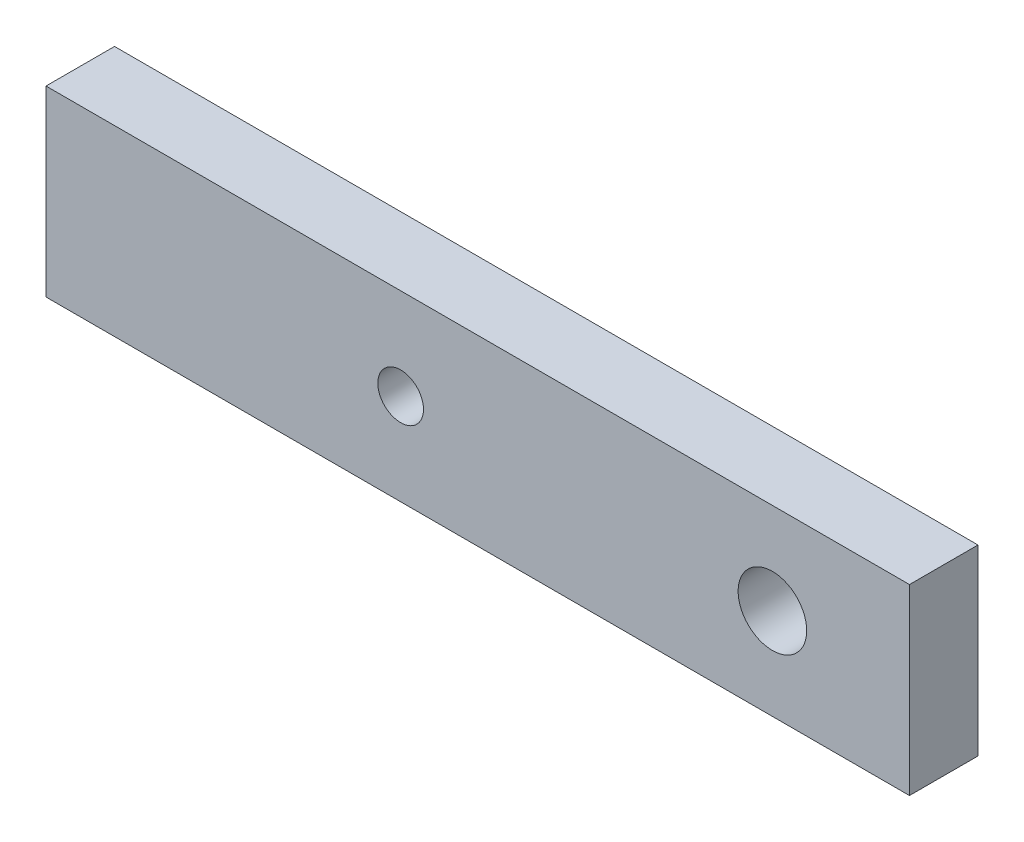
ISO-10303-21;
HEADER;
FILE_DESCRIPTION(('STEP AP214'),'2;1');
FILE_NAME('part.step','',(''),(''),'','','');
FILE_SCHEMA(('AUTOMOTIVE_DESIGN { 1 0 10303 214 1 1 1 1 }'));
ENDSEC;
DATA;
#1=APPLICATION_CONTEXT('core data for automotive mechanical design processes');
#2=APPLICATION_PROTOCOL_DEFINITION('international standard','automotive_design',2000,#1);
#3=PRODUCT_CONTEXT('',#1,'mechanical');
#4=PRODUCT('Part','Part','',(#3));
#5=PRODUCT_RELATED_PRODUCT_CATEGORY('part','',(#4));
#6=PRODUCT_DEFINITION_FORMATION('','',#4);
#7=PRODUCT_DEFINITION_CONTEXT('part definition',#1,'design');
#8=PRODUCT_DEFINITION('design','',#6,#7);
#9=PRODUCT_DEFINITION_SHAPE('','',#8);
#10=(LENGTH_UNIT() NAMED_UNIT(*) SI_UNIT(.MILLI.,.METRE.));
#11=(NAMED_UNIT(*) PLANE_ANGLE_UNIT() SI_UNIT($,.RADIAN.));
#12=(NAMED_UNIT(*) SI_UNIT($,.STERADIAN.) SOLID_ANGLE_UNIT());
#13=UNCERTAINTY_MEASURE_WITH_UNIT(LENGTH_MEASURE(1.E-05),#10,'distance_accuracy_value','');
#14=(GEOMETRIC_REPRESENTATION_CONTEXT(3) GLOBAL_UNCERTAINTY_ASSIGNED_CONTEXT((#13)) GLOBAL_UNIT_ASSIGNED_CONTEXT((#10,
#11,#12)) REPRESENTATION_CONTEXT('',''));
#15=CARTESIAN_POINT('',(0.,0.,0.));
#16=DIRECTION('',(0.,0.,1.));
#17=DIRECTION('',(1.,0.,0.));
#18=AXIS2_PLACEMENT_3D('',#15,#16,#17);
#19=CARTESIAN_POINT('',(0.,0.,150.));
#20=DIRECTION('',(0.,0.,1.));
#21=DIRECTION('',(1.,0.,0.));
#22=AXIS2_PLACEMENT_3D('',#19,#20,#21);
#23=PLANE('',#22);
#24=CARTESIAN_POINT('',(-300.,200.,150.));
#25=DIRECTION('',(0.,0.,1.));
#26=DIRECTION('',(1.,0.,0.));
#27=AXIS2_PLACEMENT_3D('',#24,#25,#26);
#28=CIRCLE('',#27,75.);
#29=CARTESIAN_POINT('',(-225.,200.,150.));
#30=VERTEX_POINT('',#29);
#31=EDGE_CURVE('E102',#30,#30,#28,.T.);
#32=ORIENTED_EDGE('',*,*,#31,.F.);
#33=EDGE_LOOP('',(#32));
#34=FACE_BOUND('',#33,.T.);
#35=DIRECTION('',(0.,1.,0.));
#36=VECTOR('',#35,1.);
#37=CARTESIAN_POINT('',(0.,0.,150.));
#38=LINE('',#37,#36);
#39=CARTESIAN_POINT('',(0.,0.,150.));
#40=VERTEX_POINT('',#39);
#41=CARTESIAN_POINT('',(0.,400.,150.));
#42=VERTEX_POINT('',#41);
#43=EDGE_CURVE('E87',#40,#42,#38,.T.);
#44=ORIENTED_EDGE('',*,*,#43,.T.);
#45=DIRECTION('',(-1.,0.,0.));
#46=VECTOR('',#45,1.);
#47=CARTESIAN_POINT('',(0.,400.,150.));
#48=LINE('',#47,#46);
#49=CARTESIAN_POINT('',(-1890.,400.,150.));
#50=VERTEX_POINT('',#49);
#51=EDGE_CURVE('E82',#42,#50,#48,.T.);
#52=ORIENTED_EDGE('',*,*,#51,.T.);
#53=DIRECTION('',(0.,-1.,0.));
#54=VECTOR('',#53,1.);
#55=CARTESIAN_POINT('',(-1890.,-3.19212258317566E-13,150.));
#56=LINE('',#55,#54);
#57=CARTESIAN_POINT('',(-1890.,-3.19212258317566E-13,150.));
#58=VERTEX_POINT('',#57);
#59=EDGE_CURVE('E85',#50,#58,#56,.T.);
#60=ORIENTED_EDGE('',*,*,#59,.T.);
#61=DIRECTION('',(1.,0.,0.));
#62=VECTOR('',#61,1.);
#63=CARTESIAN_POINT('',(0.,0.,150.));
#64=LINE('',#63,#62);
#65=EDGE_CURVE('E52',#58,#40,#64,.T.);
#66=ORIENTED_EDGE('',*,*,#65,.T.);
#67=EDGE_LOOP('',(#44,#52,#60,#66));
#68=FACE_BOUND('',#67,.T.);
#69=CARTESIAN_POINT('',(-1113.709502285,200.,150.));
#70=DIRECTION('',(0.,0.,1.));
#71=DIRECTION('',(1.,0.,0.));
#72=AXIS2_PLACEMENT_3D('',#69,#70,#71);
#73=CIRCLE('',#72,50.);
#74=CARTESIAN_POINT('',(-1063.709502285,200.,150.));
#75=VERTEX_POINT('',#74);
#76=EDGE_CURVE('E117',#75,#75,#73,.T.);
#77=ORIENTED_EDGE('',*,*,#76,.F.);
#78=EDGE_LOOP('',(#77));
#79=FACE_BOUND('',#78,.T.);
#80=ADVANCED_FACE('F35',(#34,#68,#79),#23,.T.);
#81=CARTESIAN_POINT('',(0.,0.,0.));
#82=DIRECTION('',(0.,0.,1.));
#83=DIRECTION('',(1.,0.,0.));
#84=AXIS2_PLACEMENT_3D('',#81,#82,#83);
#85=PLANE('',#84);
#86=CARTESIAN_POINT('',(-300.,200.,0.));
#87=DIRECTION('',(0.,0.,1.));
#88=DIRECTION('',(1.,0.,0.));
#89=AXIS2_PLACEMENT_3D('',#86,#87,#88);
#90=CIRCLE('',#89,75.);
#91=CARTESIAN_POINT('',(-225.,200.,0.));
#92=VERTEX_POINT('',#91);
#93=EDGE_CURVE('E114',#92,#92,#90,.T.);
#94=ORIENTED_EDGE('',*,*,#93,.T.);
#95=EDGE_LOOP('',(#94));
#96=FACE_BOUND('',#95,.T.);
#97=DIRECTION('',(0.,1.,0.));
#98=VECTOR('',#97,1.);
#99=CARTESIAN_POINT('',(0.,0.,0.));
#100=LINE('',#99,#98);
#101=CARTESIAN_POINT('',(0.,0.,0.));
#102=VERTEX_POINT('',#101);
#103=CARTESIAN_POINT('',(0.,400.,0.));
#104=VERTEX_POINT('',#103);
#105=EDGE_CURVE('E99',#102,#104,#100,.T.);
#106=ORIENTED_EDGE('',*,*,#105,.F.);
#107=DIRECTION('',(1.,0.,0.));
#108=VECTOR('',#107,1.);
#109=CARTESIAN_POINT('',(0.,0.,0.));
#110=LINE('',#109,#108);
#111=CARTESIAN_POINT('',(-1890.,-3.19212258317566E-13,0.));
#112=VERTEX_POINT('',#111);
#113=EDGE_CURVE('E75',#112,#102,#110,.T.);
#114=ORIENTED_EDGE('',*,*,#113,.F.);
#115=DIRECTION('',(0.,-1.,0.));
#116=VECTOR('',#115,1.);
#117=CARTESIAN_POINT('',(-1890.,-3.19212258317566E-13,0.));
#118=LINE('',#117,#116);
#119=CARTESIAN_POINT('',(-1890.,400.,0.));
#120=VERTEX_POINT('',#119);
#121=EDGE_CURVE('E69',#120,#112,#118,.T.);
#122=ORIENTED_EDGE('',*,*,#121,.F.);
#123=DIRECTION('',(-1.,0.,0.));
#124=VECTOR('',#123,1.);
#125=CARTESIAN_POINT('',(0.,400.,0.));
#126=LINE('',#125,#124);
#127=EDGE_CURVE('E91',#104,#120,#126,.T.);
#128=ORIENTED_EDGE('',*,*,#127,.F.);
#129=EDGE_LOOP('',(#106,#114,#122,#128));
#130=FACE_BOUND('',#129,.T.);
#131=CARTESIAN_POINT('',(-1113.709502285,200.,0.));
#132=DIRECTION('',(0.,0.,1.));
#133=DIRECTION('',(1.,0.,0.));
#134=AXIS2_PLACEMENT_3D('',#131,#132,#133);
#135=CIRCLE('',#134,50.);
#136=CARTESIAN_POINT('',(-1063.709502285,200.,0.));
#137=VERTEX_POINT('',#136);
#138=EDGE_CURVE('E120',#137,#137,#135,.T.);
#139=ORIENTED_EDGE('',*,*,#138,.T.);
#140=EDGE_LOOP('',(#139));
#141=FACE_BOUND('',#140,.T.);
#142=ADVANCED_FACE('F110',(#96,#130,#141),#85,.F.);
#143=CARTESIAN_POINT('',(0.,0.,150.));
#144=DIRECTION('',(-1.,0.,0.));
#145=DIRECTION('',(0.,0.,1.));
#146=AXIS2_PLACEMENT_3D('',#143,#144,#145);
#147=PLANE('',#146);
#148=ORIENTED_EDGE('',*,*,#105,.T.);
#149=DIRECTION('',(0.,0.,-1.));
#150=VECTOR('',#149,1.);
#151=CARTESIAN_POINT('',(0.,400.,150.));
#152=LINE('',#151,#150);
#153=EDGE_CURVE('E11',#42,#104,#152,.T.);
#154=ORIENTED_EDGE('',*,*,#153,.F.);
#155=ORIENTED_EDGE('',*,*,#43,.F.);
#156=DIRECTION('',(0.,0.,-1.));
#157=VECTOR('',#156,1.);
#158=CARTESIAN_POINT('',(0.,0.,150.));
#159=LINE('',#158,#157);
#160=EDGE_CURVE('E95',#40,#102,#159,.T.);
#161=ORIENTED_EDGE('',*,*,#160,.T.);
#162=EDGE_LOOP('',(#148,#154,#155,#161));
#163=FACE_BOUND('',#162,.T.);
#164=ADVANCED_FACE('F37',(#163),#147,.F.);
#165=CARTESIAN_POINT('',(0.,400.,150.));
#166=DIRECTION('',(0.,-1.,0.));
#167=DIRECTION('',(1.,0.,0.));
#168=AXIS2_PLACEMENT_3D('',#165,#166,#167);
#169=PLANE('',#168);
#170=ORIENTED_EDGE('',*,*,#127,.T.);
#171=DIRECTION('',(0.,0.,-1.));
#172=VECTOR('',#171,1.);
#173=CARTESIAN_POINT('',(-1890.,400.,150.));
#174=LINE('',#173,#172);
#175=EDGE_CURVE('E44',#50,#120,#174,.T.);
#176=ORIENTED_EDGE('',*,*,#175,.F.);
#177=ORIENTED_EDGE('',*,*,#51,.F.);
#178=ORIENTED_EDGE('',*,*,#153,.T.);
#179=EDGE_LOOP('',(#170,#176,#177,#178));
#180=FACE_BOUND('',#179,.T.);
#181=ADVANCED_FACE('F90',(#180),#169,.F.);
#182=CARTESIAN_POINT('',(-1890.,-3.19212258317566E-13,150.));
#183=DIRECTION('',(1.,0.,0.));
#184=DIRECTION('',(0.,0.,-1.));
#185=AXIS2_PLACEMENT_3D('',#182,#183,#184);
#186=PLANE('',#185);
#187=ORIENTED_EDGE('',*,*,#121,.T.);
#188=DIRECTION('',(0.,0.,-1.));
#189=VECTOR('',#188,1.);
#190=CARTESIAN_POINT('',(-1890.,-3.19212258317566E-13,150.));
#191=LINE('',#190,#189);
#192=EDGE_CURVE('E92',#58,#112,#191,.T.);
#193=ORIENTED_EDGE('',*,*,#192,.F.);
#194=ORIENTED_EDGE('',*,*,#59,.F.);
#195=ORIENTED_EDGE('',*,*,#175,.T.);
#196=EDGE_LOOP('',(#187,#193,#194,#195));
#197=FACE_BOUND('',#196,.T.);
#198=ADVANCED_FACE('F93',(#197),#186,.F.);
#199=CARTESIAN_POINT('',(0.,0.,150.));
#200=DIRECTION('',(0.,1.,0.));
#201=DIRECTION('',(-1.,0.,0.));
#202=AXIS2_PLACEMENT_3D('',#199,#200,#201);
#203=PLANE('',#202);
#204=ORIENTED_EDGE('',*,*,#113,.T.);
#205=ORIENTED_EDGE('',*,*,#160,.F.);
#206=ORIENTED_EDGE('',*,*,#65,.F.);
#207=ORIENTED_EDGE('',*,*,#192,.T.);
#208=EDGE_LOOP('',(#204,#205,#206,#207));
#209=FACE_BOUND('',#208,.T.);
#210=ADVANCED_FACE('F107',(#209),#203,.F.);
#211=CARTESIAN_POINT('',(-300.,200.,150.));
#212=DIRECTION('',(0.,0.,-1.));
#213=DIRECTION('',(-1.,0.,0.));
#214=AXIS2_PLACEMENT_3D('',#211,#212,#213);
#215=CYLINDRICAL_SURFACE('',#214,75.);
#216=ORIENTED_EDGE('',*,*,#31,.T.);
#217=EDGE_LOOP('',(#216));
#218=FACE_BOUND('',#217,.T.);
#219=ORIENTED_EDGE('',*,*,#93,.F.);
#220=EDGE_LOOP('',(#219));
#221=FACE_BOUND('',#220,.T.);
#222=ADVANCED_FACE('F138',(#218,#221),#215,.F.);
#223=CARTESIAN_POINT('',(-1113.709502285,200.,150.));
#224=DIRECTION('',(0.,0.,-1.));
#225=DIRECTION('',(-1.,0.,0.));
#226=AXIS2_PLACEMENT_3D('',#223,#224,#225);
#227=CYLINDRICAL_SURFACE('',#226,50.);
#228=ORIENTED_EDGE('',*,*,#76,.T.);
#229=EDGE_LOOP('',(#228));
#230=FACE_BOUND('',#229,.T.);
#231=ORIENTED_EDGE('',*,*,#138,.F.);
#232=EDGE_LOOP('',(#231));
#233=FACE_BOUND('',#232,.T.);
#234=ADVANCED_FACE('F126',(#230,#233),#227,.F.);
#235=CLOSED_SHELL('',(#80,#142,#164,#181,#198,#210,#222,#234));
#236=MANIFOLD_SOLID_BREP('B2',#235);
#237=ADVANCED_BREP_SHAPE_REPRESENTATION('',(#18,#236),#14);
#238=SHAPE_DEFINITION_REPRESENTATION(#9,#237);
ENDSEC;
END-ISO-10303-21;
